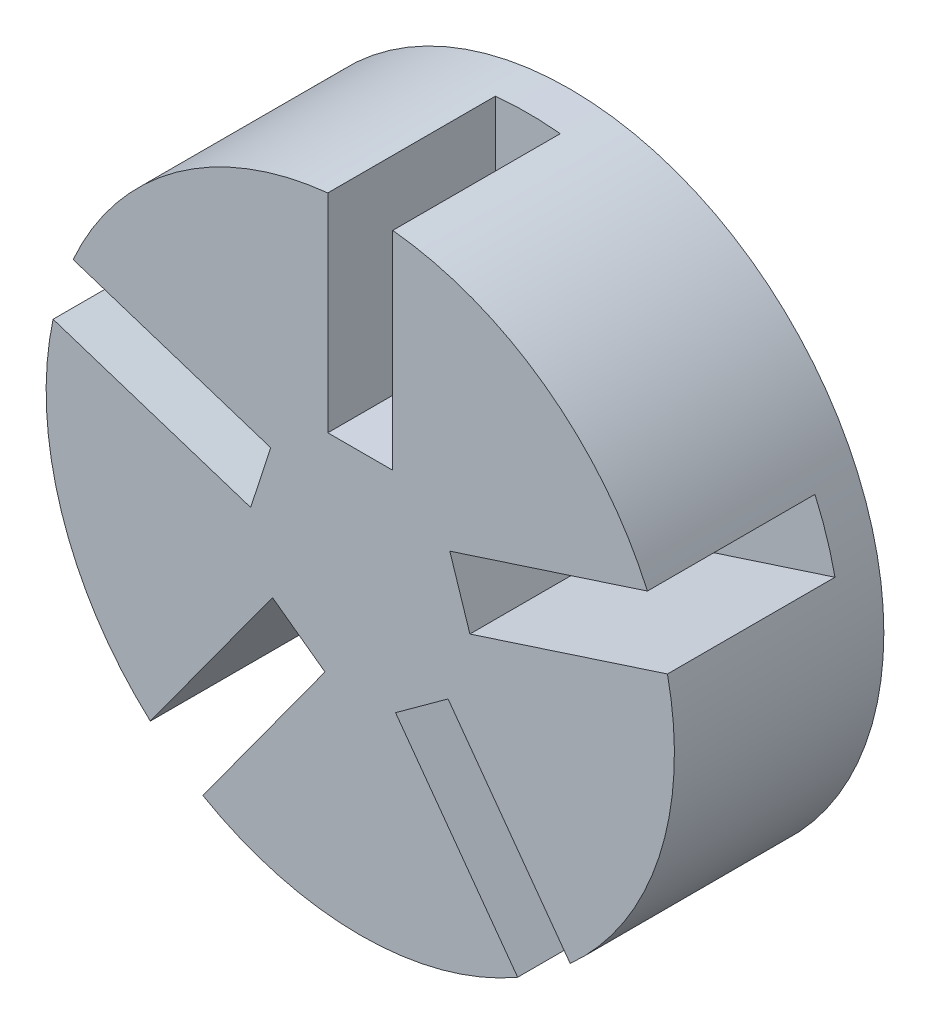
ISO-10303-21;
HEADER;
FILE_DESCRIPTION(('STEP AP214'),'2;1');
FILE_NAME('part.step','',(''),(''),'','','');
FILE_SCHEMA(('AUTOMOTIVE_DESIGN { 1 0 10303 214 1 1 1 1 }'));
ENDSEC;
DATA;
#1=APPLICATION_CONTEXT('core data for automotive mechanical design processes');
#2=APPLICATION_PROTOCOL_DEFINITION('international standard','automotive_design',2000,#1);
#3=PRODUCT_CONTEXT('',#1,'mechanical');
#4=PRODUCT('Part','Part','',(#3));
#5=PRODUCT_RELATED_PRODUCT_CATEGORY('part','',(#4));
#6=PRODUCT_DEFINITION_FORMATION('','',#4);
#7=PRODUCT_DEFINITION_CONTEXT('part definition',#1,'design');
#8=PRODUCT_DEFINITION('design','',#6,#7);
#9=PRODUCT_DEFINITION_SHAPE('','',#8);
#10=(LENGTH_UNIT() NAMED_UNIT(*) SI_UNIT(.MILLI.,.METRE.));
#11=(NAMED_UNIT(*) PLANE_ANGLE_UNIT() SI_UNIT($,.RADIAN.));
#12=(NAMED_UNIT(*) SI_UNIT($,.STERADIAN.) SOLID_ANGLE_UNIT());
#13=UNCERTAINTY_MEASURE_WITH_UNIT(LENGTH_MEASURE(1.E-05),#10,'distance_accuracy_value','');
#14=(GEOMETRIC_REPRESENTATION_CONTEXT(3) GLOBAL_UNCERTAINTY_ASSIGNED_CONTEXT((#13)) GLOBAL_UNIT_ASSIGNED_CONTEXT((#10,
#11,#12)) REPRESENTATION_CONTEXT('',''));
#15=CARTESIAN_POINT('',(0.,0.,0.));
#16=DIRECTION('',(0.,0.,1.));
#17=DIRECTION('',(1.,0.,0.));
#18=AXIS2_PLACEMENT_3D('',#15,#16,#17);
#19=CARTESIAN_POINT('',(0.,0.,10.));
#20=DIRECTION('',(0.,0.,-1.));
#21=DIRECTION('',(-1.,0.,0.));
#22=AXIS2_PLACEMENT_3D('',#19,#20,#21);
#23=CYLINDRICAL_SURFACE('',#22,15.);
#24=CARTESIAN_POINT('',(0.,0.,10.));
#25=DIRECTION('',(0.,0.,1.));
#26=DIRECTION('',(1.,0.,0.));
#27=AXIS2_PLACEMENT_3D('',#24,#25,#26);
#28=CIRCLE('',#27,15.);
#29=CARTESIAN_POINT('',(-14.6684559019519,3.13630378829802,10.));
#30=VERTEX_POINT('',#29);
#31=CARTESIAN_POINT('',(-10.0235569924466,-11.1592251173267,10.));
#32=VERTEX_POINT('',#31);
#33=EDGE_CURVE('E351',#30,#32,#28,.T.);
#34=ORIENTED_EDGE('',*,*,#33,.F.);
#35=DIRECTION('',(0.,0.,-1.));
#36=VECTOR('',#35,1.);
#37=CARTESIAN_POINT('',(-14.6684559019519,3.13630378829802,10.));
#38=LINE('',#37,#36);
#39=CARTESIAN_POINT('',(-14.6684559019519,3.13630378829802,2.));
#40=VERTEX_POINT('',#39);
#41=EDGE_CURVE('E303',#30,#40,#38,.T.);
#42=ORIENTED_EDGE('',*,*,#41,.T.);
#43=CARTESIAN_POINT('',(0.,0.,2.));
#44=DIRECTION('',(0.,0.,-1.));
#45=DIRECTION('',(-1.,0.,0.));
#46=AXIS2_PLACEMENT_3D('',#43,#44,#45);
#47=CIRCLE('',#46,15.);
#48=CARTESIAN_POINT('',(-13.7105032193897,6.08457898881304,2.));
#49=VERTEX_POINT('',#48);
#50=EDGE_CURVE('E11',#40,#49,#47,.T.);
#51=ORIENTED_EDGE('',*,*,#50,.T.);
#52=DIRECTION('',(0.,0.,-1.));
#53=VECTOR('',#52,1.);
#54=CARTESIAN_POINT('',(-13.7105032193897,6.08457898881304,10.));
#55=LINE('',#54,#53);
#56=CARTESIAN_POINT('',(-13.7105032193897,6.08457898881304,10.));
#57=VERTEX_POINT('',#56);
#58=EDGE_CURVE('E300',#49,#57,#55,.F.);
#59=ORIENTED_EDGE('',*,*,#58,.T.);
#60=CARTESIAN_POINT('',(-1.55,14.9197017396461,10.));
#61=VERTEX_POINT('',#60);
#62=EDGE_CURVE('E352',#61,#57,#28,.T.);
#63=ORIENTED_EDGE('',*,*,#62,.F.);
#64=DIRECTION('',(0.,0.,-1.));
#65=VECTOR('',#64,1.);
#66=CARTESIAN_POINT('',(-1.55,14.9197017396461,10.));
#67=LINE('',#66,#65);
#68=CARTESIAN_POINT('',(-1.55,14.9197017396461,2.));
#69=VERTEX_POINT('',#68);
#70=EDGE_CURVE('E276',#61,#69,#67,.T.);
#71=ORIENTED_EDGE('',*,*,#70,.T.);
#72=CARTESIAN_POINT('',(0.,0.,2.));
#73=DIRECTION('',(0.,0.,1.));
#74=DIRECTION('',(1.,0.,0.));
#75=AXIS2_PLACEMENT_3D('',#72,#73,#74);
#76=CIRCLE('',#75,15.);
#77=CARTESIAN_POINT('',(1.55,14.9197017396461,2.));
#78=VERTEX_POINT('',#77);
#79=EDGE_CURVE('E325',#78,#69,#76,.T.);
#80=ORIENTED_EDGE('',*,*,#79,.F.);
#81=DIRECTION('',(0.,0.,-1.));
#82=VECTOR('',#81,1.);
#83=CARTESIAN_POINT('',(1.55,14.9197017396461,10.));
#84=LINE('',#83,#82);
#85=CARTESIAN_POINT('',(1.55,14.9197017396461,10.));
#86=VERTEX_POINT('',#85);
#87=EDGE_CURVE('E281',#78,#86,#84,.F.);
#88=ORIENTED_EDGE('',*,*,#87,.T.);
#89=CARTESIAN_POINT('',(13.7105032193893,6.08457898881385,10.));
#90=VERTEX_POINT('',#89);
#91=EDGE_CURVE('E313',#90,#86,#28,.T.);
#92=ORIENTED_EDGE('',*,*,#91,.F.);
#93=DIRECTION('',(0.,0.,-1.));
#94=VECTOR('',#93,1.);
#95=CARTESIAN_POINT('',(13.7105032193893,6.08457898881385,10.));
#96=LINE('',#95,#94);
#97=CARTESIAN_POINT('',(13.7105032193893,6.08457898881385,2.));
#98=VERTEX_POINT('',#97);
#99=EDGE_CURVE('E182',#90,#98,#96,.T.);
#100=ORIENTED_EDGE('',*,*,#99,.T.);
#101=CARTESIAN_POINT('',(0.,0.,2.));
#102=DIRECTION('',(0.,0.,-1.));
#103=DIRECTION('',(-1.,0.,0.));
#104=AXIS2_PLACEMENT_3D('',#101,#102,#103);
#105=CIRCLE('',#104,15.);
#106=CARTESIAN_POINT('',(14.6684559019517,3.13630378829889,2.));
#107=VERTEX_POINT('',#106);
#108=EDGE_CURVE('E327',#98,#107,#105,.T.);
#109=ORIENTED_EDGE('',*,*,#108,.T.);
#110=DIRECTION('',(0.,0.,-1.));
#111=VECTOR('',#110,1.);
#112=CARTESIAN_POINT('',(14.6684559019517,3.13630378829889,10.));
#113=LINE('',#112,#111);
#114=CARTESIAN_POINT('',(14.6684559019517,3.13630378829889,10.));
#115=VERTEX_POINT('',#114);
#116=EDGE_CURVE('E284',#107,#115,#113,.F.);
#117=ORIENTED_EDGE('',*,*,#116,.T.);
#118=CARTESIAN_POINT('',(10.0235569924483,-11.1592251173252,10.));
#119=VERTEX_POINT('',#118);
#120=EDGE_CURVE('E310',#119,#115,#28,.T.);
#121=ORIENTED_EDGE('',*,*,#120,.F.);
#122=DIRECTION('',(0.,0.,-1.));
#123=VECTOR('',#122,1.);
#124=CARTESIAN_POINT('',(10.0235569924483,-11.1592251173252,10.));
#125=LINE('',#124,#123);
#126=CARTESIAN_POINT('',(10.0235569924483,-11.1592251173252,2.));
#127=VERTEX_POINT('',#126);
#128=EDGE_CURVE('E291',#119,#127,#125,.T.);
#129=ORIENTED_EDGE('',*,*,#128,.T.);
#130=CARTESIAN_POINT('',(0.,0.,2.));
#131=DIRECTION('',(0.,0.,-1.));
#132=DIRECTION('',(-1.,0.,0.));
#133=AXIS2_PLACEMENT_3D('',#130,#131,#132);
#134=CIRCLE('',#133,15.);
#135=CARTESIAN_POINT('',(7.51560430988609,-12.981359399432,2.));
#136=VERTEX_POINT('',#135);
#137=EDGE_CURVE('E330',#127,#136,#134,.T.);
#138=ORIENTED_EDGE('',*,*,#137,.T.);
#139=DIRECTION('',(0.,0.,-1.));
#140=VECTOR('',#139,1.);
#141=CARTESIAN_POINT('',(7.51560430988609,-12.981359399432,10.));
#142=LINE('',#141,#140);
#143=CARTESIAN_POINT('',(7.51560430988609,-12.981359399432,10.));
#144=VERTEX_POINT('',#143);
#145=EDGE_CURVE('E288',#136,#144,#142,.F.);
#146=ORIENTED_EDGE('',*,*,#145,.T.);
#147=CARTESIAN_POINT('',(-7.51560430988409,-12.9813593994332,10.));
#148=VERTEX_POINT('',#147);
#149=EDGE_CURVE('E312',#148,#144,#28,.T.);
#150=ORIENTED_EDGE('',*,*,#149,.F.);
#151=DIRECTION('',(0.,0.,-1.));
#152=VECTOR('',#151,1.);
#153=CARTESIAN_POINT('',(-7.51560430988409,-12.9813593994332,10.));
#154=LINE('',#153,#152);
#155=CARTESIAN_POINT('',(-7.51560430988409,-12.9813593994332,2.));
#156=VERTEX_POINT('',#155);
#157=EDGE_CURVE('E297',#148,#156,#154,.T.);
#158=ORIENTED_EDGE('',*,*,#157,.T.);
#159=CARTESIAN_POINT('',(0.,0.,2.));
#160=DIRECTION('',(0.,0.,-1.));
#161=DIRECTION('',(-1.,0.,0.));
#162=AXIS2_PLACEMENT_3D('',#159,#160,#161);
#163=CIRCLE('',#162,15.);
#164=CARTESIAN_POINT('',(-10.0235569924466,-11.1592251173267,2.));
#165=VERTEX_POINT('',#164);
#166=EDGE_CURVE('E44',#156,#165,#163,.T.);
#167=ORIENTED_EDGE('',*,*,#166,.T.);
#168=DIRECTION('',(0.,0.,-1.));
#169=VECTOR('',#168,1.);
#170=CARTESIAN_POINT('',(-10.0235569924466,-11.1592251173267,10.));
#171=LINE('',#170,#169);
#172=EDGE_CURVE('E294',#165,#32,#171,.F.);
#173=ORIENTED_EDGE('',*,*,#172,.T.);
#174=EDGE_LOOP('',(#34,#42,#51,#59,#63,#71,#80,#88,#92,#100,#109,#117,#121,#129,#138,#146,#150,
#158,#167,#173));
#175=FACE_BOUND('',#174,.T.);
#176=CARTESIAN_POINT('',(0.,0.,0.));
#177=DIRECTION('',(0.,0.,1.));
#178=DIRECTION('',(1.,0.,0.));
#179=AXIS2_PLACEMENT_3D('',#176,#177,#178);
#180=CIRCLE('',#179,15.);
#181=CARTESIAN_POINT('',(15.,0.,0.));
#182=VERTEX_POINT('',#181);
#183=EDGE_CURVE('E309',#182,#182,#180,.T.);
#184=ORIENTED_EDGE('',*,*,#183,.T.);
#185=EDGE_LOOP('',(#184));
#186=FACE_BOUND('',#185,.T.);
#187=ADVANCED_FACE('F37',(#175,#186),#23,.T.);
#188=CARTESIAN_POINT('',(0.,0.,10.));
#189=DIRECTION('',(0.,0.,1.));
#190=DIRECTION('',(1.,0.,0.));
#191=AXIS2_PLACEMENT_3D('',#188,#189,#190);
#192=PLANE('',#191);
#193=DIRECTION('',(0.951056516295154,-0.309016994374947,0.));
#194=VECTOR('',#193,1.);
#195=CARTESIAN_POINT('',(-0.478976341281359,-1.47413760025808,10.));
#196=LINE('',#195,#194);
#197=CARTESIAN_POINT('',(-5.23425892275668,0.0709473716165136,10.));
#198=VERTEX_POINT('',#197);
#199=EDGE_CURVE('E323',#30,#198,#196,.T.);
#200=ORIENTED_EDGE('',*,*,#199,.F.);
#201=ORIENTED_EDGE('',*,*,#33,.T.);
#202=DIRECTION('',(-0.587785252292473,-0.809016994374948,0.));
#203=VECTOR('',#202,1.);
#204=CARTESIAN_POINT('',(-19.0396982170381,-23.5688788912693,10.));
#205=LINE('',#204,#203);
#206=CARTESIAN_POINT('',(-4.1929026027425,-3.13401783082212,10.));
#207=VERTEX_POINT('',#206);
#208=EDGE_CURVE('E238',#207,#32,#205,.T.);
#209=ORIENTED_EDGE('',*,*,#208,.F.);
#210=DIRECTION('',(-0.809016994374947,0.587785252292473,0.));
#211=VECTOR('',#210,1.);
#212=CARTESIAN_POINT('',(-1.68494992018016,-4.95615211292879,10.));
#213=LINE('',#212,#211);
#214=CARTESIAN_POINT('',(-1.68494992018016,-4.95615211292879,10.));
#215=VERTEX_POINT('',#214);
#216=EDGE_CURVE('E59',#215,#207,#213,.T.);
#217=ORIENTED_EDGE('',*,*,#216,.F.);
#218=DIRECTION('',(0.587785252292473,0.809016994374947,0.));
#219=VECTOR('',#218,1.);
#220=CARTESIAN_POINT('',(1.25397634128219,-0.911067141054074,10.));
#221=LINE('',#220,#219);
#222=EDGE_CURVE('E321',#148,#215,#221,.T.);
#223=ORIENTED_EDGE('',*,*,#222,.F.);
#224=ORIENTED_EDGE('',*,*,#149,.T.);
#225=DIRECTION('',(0.587785252292473,-0.809016994374947,0.));
#226=VECTOR('',#225,1.);
#227=CARTESIAN_POINT('',(16.5317455344781,-25.3910131733753,10.));
#228=LINE('',#227,#226);
#229=CARTESIAN_POINT('',(1.68494992018246,-4.95615211292805,10.));
#230=VERTEX_POINT('',#229);
#231=EDGE_CURVE('E223',#230,#144,#228,.T.);
#232=ORIENTED_EDGE('',*,*,#231,.F.);
#233=DIRECTION('',(-0.809016994374947,-0.587785252292473,0.));
#234=VECTOR('',#233,1.);
#235=CARTESIAN_POINT('',(4.1929026027448,-3.13401783082138,10.));
#236=LINE('',#235,#234);
#237=CARTESIAN_POINT('',(4.1929026027448,-3.13401783082138,10.));
#238=VERTEX_POINT('',#237);
#239=EDGE_CURVE('E197',#238,#230,#236,.T.);
#240=ORIENTED_EDGE('',*,*,#239,.F.);
#241=DIRECTION('',(-0.587785252292473,0.809016994374947,0.));
#242=VECTOR('',#241,1.);
#243=CARTESIAN_POINT('',(1.253976341282,0.911067141053941,10.));
#244=LINE('',#243,#242);
#245=EDGE_CURVE('E187',#119,#238,#244,.T.);
#246=ORIENTED_EDGE('',*,*,#245,.F.);
#247=ORIENTED_EDGE('',*,*,#120,.T.);
#248=DIRECTION('',(0.951056516295153,0.309016994374948,0.));
#249=VECTOR('',#248,1.);
#250=CARTESIAN_POINT('',(29.2568788507108,7.87636974132684,10.));
#251=LINE('',#250,#249);
#252=CARTESIAN_POINT('',(5.23425892275756,0.0709473716177216,10.));
#253=VERTEX_POINT('',#252);
#254=EDGE_CURVE('E203',#253,#115,#251,.T.);
#255=ORIENTED_EDGE('',*,*,#254,.F.);
#256=DIRECTION('',(0.309016994374947,-0.951056516295154,0.));
#257=VECTOR('',#256,1.);
#258=CARTESIAN_POINT('',(4.27630624019522,3.0192225721327,10.));
#259=LINE('',#258,#257);
#260=CARTESIAN_POINT('',(4.27630624019522,3.0192225721327,10.));
#261=VERTEX_POINT('',#260);
#262=EDGE_CURVE('E192',#261,#253,#259,.T.);
#263=ORIENTED_EDGE('',*,*,#262,.F.);
#264=DIRECTION('',(-0.951056516295154,-0.309016994374948,0.));
#265=VECTOR('',#264,1.);
#266=CARTESIAN_POINT('',(-0.478976341281248,1.47413760025773,10.));
#267=LINE('',#266,#265);
#268=EDGE_CURVE('E175',#90,#261,#267,.T.);
#269=ORIENTED_EDGE('',*,*,#268,.F.);
#270=ORIENTED_EDGE('',*,*,#91,.T.);
#271=DIRECTION('',(0.,1.,0.));
#272=VECTOR('',#271,1.);
#273=CARTESIAN_POINT('',(1.55,30.2588773814762,10.));
#274=LINE('',#273,#272);
#275=CARTESIAN_POINT('',(1.55,5.,10.));
#276=VERTEX_POINT('',#275);
#277=EDGE_CURVE('E204',#276,#86,#274,.T.);
#278=ORIENTED_EDGE('',*,*,#277,.F.);
#279=DIRECTION('',(1.,0.,0.));
#280=VECTOR('',#279,1.);
#281=CARTESIAN_POINT('',(-1.55,5.,10.));
#282=LINE('',#281,#280);
#283=CARTESIAN_POINT('',(-1.55,5.,10.));
#284=VERTEX_POINT('',#283);
#285=EDGE_CURVE('E206',#284,#276,#282,.T.);
#286=ORIENTED_EDGE('',*,*,#285,.F.);
#287=DIRECTION('',(0.,-1.,0.));
#288=VECTOR('',#287,1.);
#289=CARTESIAN_POINT('',(-1.55,0.,10.));
#290=LINE('',#289,#288);
#291=EDGE_CURVE('E188',#61,#284,#290,.T.);
#292=ORIENTED_EDGE('',*,*,#291,.F.);
#293=ORIENTED_EDGE('',*,*,#62,.T.);
#294=DIRECTION('',(-0.951056516295154,0.309016994374947,0.));
#295=VECTOR('',#294,1.);
#296=CARTESIAN_POINT('',(-28.2989261681476,10.8246449418406,10.));
#297=LINE('',#296,#295);
#298=CARTESIAN_POINT('',(-4.27630624019434,3.01922257213149,10.));
#299=VERTEX_POINT('',#298);
#300=EDGE_CURVE('E253',#299,#57,#297,.T.);
#301=ORIENTED_EDGE('',*,*,#300,.F.);
#302=DIRECTION('',(0.309016994374947,0.951056516295154,0.));
#303=VECTOR('',#302,1.);
#304=CARTESIAN_POINT('',(-5.23425892275668,0.0709473716165136,10.));
#305=LINE('',#304,#303);
#306=EDGE_CURVE('E51',#198,#299,#305,.T.);
#307=ORIENTED_EDGE('',*,*,#306,.F.);
#308=EDGE_LOOP('',(#200,#201,#209,#217,#223,#224,#232,#240,#246,#247,#255,#263,#269,#270,#278,
#286,#292,#293,#301,#307));
#309=FACE_BOUND('',#308,.T.);
#310=ADVANCED_FACE('F201',(#309),#192,.T.);
#311=CARTESIAN_POINT('',(0.,0.,0.));
#312=DIRECTION('',(0.,0.,1.));
#313=DIRECTION('',(1.,0.,0.));
#314=AXIS2_PLACEMENT_3D('',#311,#312,#313);
#315=PLANE('',#314);
#316=CARTESIAN_POINT('',(0.,0.,0.));
#317=DIRECTION('',(0.,0.,1.));
#318=DIRECTION('',(1.,0.,0.));
#319=AXIS2_PLACEMENT_3D('',#316,#317,#318);
#320=CIRCLE('',#319,1.95);
#321=CARTESIAN_POINT('',(1.95,0.,0.));
#322=VERTEX_POINT('',#321);
#323=EDGE_CURVE('E316',#322,#322,#320,.F.);
#324=ORIENTED_EDGE('',*,*,#323,.F.);
#325=EDGE_LOOP('',(#324));
#326=FACE_BOUND('',#325,.T.);
#327=ORIENTED_EDGE('',*,*,#183,.F.);
#328=EDGE_LOOP('',(#327));
#329=FACE_BOUND('',#328,.T.);
#330=ADVANCED_FACE('F414',(#326,#329),#315,.F.);
#331=CARTESIAN_POINT('',(0.,0.,-4.));
#332=DIRECTION('',(0.,0.,1.));
#333=DIRECTION('',(1.,0.,0.));
#334=AXIS2_PLACEMENT_3D('',#331,#332,#333);
#335=CYLINDRICAL_SURFACE('',#334,1.95);
#336=CARTESIAN_POINT('',(0.,0.,-4.));
#337=DIRECTION('',(0.,0.,-1.));
#338=DIRECTION('',(-1.,0.,0.));
#339=AXIS2_PLACEMENT_3D('',#336,#337,#338);
#340=CIRCLE('',#339,1.95);
#341=CARTESIAN_POINT('',(-1.95,0.,-4.));
#342=VERTEX_POINT('',#341);
#343=EDGE_CURVE('E306',#342,#342,#340,.T.);
#344=ORIENTED_EDGE('',*,*,#343,.F.);
#345=EDGE_LOOP('',(#344));
#346=FACE_BOUND('',#345,.T.);
#347=ORIENTED_EDGE('',*,*,#323,.T.);
#348=EDGE_LOOP('',(#347));
#349=FACE_BOUND('',#348,.T.);
#350=ADVANCED_FACE('F419',(#346,#349),#335,.T.);
#351=CARTESIAN_POINT('',(0.,0.,-4.));
#352=DIRECTION('',(0.,0.,-1.));
#353=DIRECTION('',(-1.,0.,0.));
#354=AXIS2_PLACEMENT_3D('',#351,#352,#353);
#355=PLANE('',#354);
#356=ORIENTED_EDGE('',*,*,#343,.T.);
#357=EDGE_LOOP('',(#356));
#358=FACE_BOUND('',#357,.T.);
#359=ADVANCED_FACE('F424',(#358),#355,.T.);
#360=CARTESIAN_POINT('',(0.,0.,2.));
#361=DIRECTION('',(0.,0.,1.));
#362=DIRECTION('',(1.,0.,0.));
#363=AXIS2_PLACEMENT_3D('',#360,#361,#362);
#364=PLANE('',#363);
#365=ORIENTED_EDGE('',*,*,#79,.T.);
#366=DIRECTION('',(0.,-1.,0.));
#367=VECTOR('',#366,1.);
#368=CARTESIAN_POINT('',(-1.55,30.2588773814762,2.));
#369=LINE('',#368,#367);
#370=CARTESIAN_POINT('',(-1.55,5.,2.));
#371=VERTEX_POINT('',#370);
#372=EDGE_CURVE('E266',#69,#371,#369,.T.);
#373=ORIENTED_EDGE('',*,*,#372,.T.);
#374=DIRECTION('',(1.,0.,0.));
#375=VECTOR('',#374,1.);
#376=CARTESIAN_POINT('',(-1.55,5.,2.));
#377=LINE('',#376,#375);
#378=CARTESIAN_POINT('',(1.55,5.,2.));
#379=VERTEX_POINT('',#378);
#380=EDGE_CURVE('E268',#371,#379,#377,.T.);
#381=ORIENTED_EDGE('',*,*,#380,.T.);
#382=DIRECTION('',(0.,1.,0.));
#383=VECTOR('',#382,1.);
#384=CARTESIAN_POINT('',(1.55,30.2588773814762,2.));
#385=LINE('',#384,#383);
#386=EDGE_CURVE('E263',#379,#78,#385,.T.);
#387=ORIENTED_EDGE('',*,*,#386,.T.);
#388=EDGE_LOOP('',(#365,#373,#381,#387));
#389=FACE_BOUND('',#388,.T.);
#390=ADVANCED_FACE('F428',(#389),#364,.T.);
#391=CARTESIAN_POINT('',(1.55,30.2588773814762,2.));
#392=DIRECTION('',(1.,0.,0.));
#393=DIRECTION('',(0.,1.,0.));
#394=AXIS2_PLACEMENT_3D('',#391,#392,#393);
#395=PLANE('',#394);
#396=ORIENTED_EDGE('',*,*,#386,.F.);
#397=DIRECTION('',(0.,0.,1.));
#398=VECTOR('',#397,1.);
#399=CARTESIAN_POINT('',(1.55,5.,2.));
#400=LINE('',#399,#398);
#401=EDGE_CURVE('E274',#379,#276,#400,.T.);
#402=ORIENTED_EDGE('',*,*,#401,.T.);
#403=ORIENTED_EDGE('',*,*,#277,.T.);
#404=ORIENTED_EDGE('',*,*,#87,.F.);
#405=EDGE_LOOP('',(#396,#402,#403,#404));
#406=FACE_BOUND('',#405,.T.);
#407=ADVANCED_FACE('F381',(#406),#395,.F.);
#408=CARTESIAN_POINT('',(-1.55,30.2588773814762,2.));
#409=DIRECTION('',(-1.,0.,0.));
#410=DIRECTION('',(0.,-1.,0.));
#411=AXIS2_PLACEMENT_3D('',#408,#409,#410);
#412=PLANE('',#411);
#413=ORIENTED_EDGE('',*,*,#291,.T.);
#414=DIRECTION('',(0.,0.,1.));
#415=VECTOR('',#414,1.);
#416=CARTESIAN_POINT('',(-1.55,5.,2.));
#417=LINE('',#416,#415);
#418=EDGE_CURVE('E270',#371,#284,#417,.T.);
#419=ORIENTED_EDGE('',*,*,#418,.F.);
#420=ORIENTED_EDGE('',*,*,#372,.F.);
#421=ORIENTED_EDGE('',*,*,#70,.F.);
#422=EDGE_LOOP('',(#413,#419,#420,#421));
#423=FACE_BOUND('',#422,.T.);
#424=ADVANCED_FACE('F388',(#423),#412,.F.);
#425=CARTESIAN_POINT('',(-1.55,5.,2.));
#426=DIRECTION('',(0.,-1.,0.));
#427=DIRECTION('',(0.,0.,-1.));
#428=AXIS2_PLACEMENT_3D('',#425,#426,#427);
#429=PLANE('',#428);
#430=ORIENTED_EDGE('',*,*,#285,.T.);
#431=ORIENTED_EDGE('',*,*,#401,.F.);
#432=ORIENTED_EDGE('',*,*,#380,.F.);
#433=ORIENTED_EDGE('',*,*,#418,.T.);
#434=EDGE_LOOP('',(#430,#431,#432,#433));
#435=FACE_BOUND('',#434,.T.);
#436=ADVANCED_FACE('F384',(#435),#429,.F.);
#437=CARTESIAN_POINT('',(0.,0.,2.));
#438=DIRECTION('',(0.,0.,-1.));
#439=DIRECTION('',(-1.,0.,0.));
#440=AXIS2_PLACEMENT_3D('',#437,#438,#439);
#441=PLANE('',#440);
#442=DIRECTION('',(-0.951056516295153,-0.309016994374948,0.));
#443=VECTOR('',#442,1.);
#444=CARTESIAN_POINT('',(28.2989261681484,10.8246449418418,2.));
#445=LINE('',#444,#443);
#446=CARTESIAN_POINT('',(4.27630624019522,3.0192225721327,2.));
#447=VERTEX_POINT('',#446);
#448=EDGE_CURVE('E210',#98,#447,#445,.T.);
#449=ORIENTED_EDGE('',*,*,#448,.T.);
#450=DIRECTION('',(0.309016994374947,-0.951056516295154,0.));
#451=VECTOR('',#450,1.);
#452=CARTESIAN_POINT('',(4.27630624019522,3.0192225721327,2.));
#453=LINE('',#452,#451);
#454=CARTESIAN_POINT('',(5.23425892275756,0.0709473716177202,2.));
#455=VERTEX_POINT('',#454);
#456=EDGE_CURVE('E195',#447,#455,#453,.T.);
#457=ORIENTED_EDGE('',*,*,#456,.T.);
#458=DIRECTION('',(0.951056516295153,0.309016994374948,0.));
#459=VECTOR('',#458,1.);
#460=CARTESIAN_POINT('',(29.2568788507108,7.87636974132684,2.));
#461=LINE('',#460,#459);
#462=EDGE_CURVE('E212',#455,#107,#461,.T.);
#463=ORIENTED_EDGE('',*,*,#462,.T.);
#464=ORIENTED_EDGE('',*,*,#108,.F.);
#465=EDGE_LOOP('',(#449,#457,#463,#464));
#466=FACE_BOUND('',#465,.T.);
#467=ADVANCED_FACE('F374',(#466),#441,.F.);
#468=CARTESIAN_POINT('',(28.2989261681484,10.8246449418418,2.));
#469=DIRECTION('',(-0.309016994374948,0.951056516295154,0.));
#470=DIRECTION('',(-0.951056516295154,-0.309016994374948,0.));
#471=AXIS2_PLACEMENT_3D('',#468,#469,#470);
#472=PLANE('',#471);
#473=ORIENTED_EDGE('',*,*,#268,.T.);
#474=DIRECTION('',(0.,0.,1.));
#475=VECTOR('',#474,1.);
#476=CARTESIAN_POINT('',(4.27630624019522,3.0192225721327,2.));
#477=LINE('',#476,#475);
#478=EDGE_CURVE('E179',#447,#261,#477,.T.);
#479=ORIENTED_EDGE('',*,*,#478,.F.);
#480=ORIENTED_EDGE('',*,*,#448,.F.);
#481=ORIENTED_EDGE('',*,*,#99,.F.);
#482=EDGE_LOOP('',(#473,#479,#480,#481));
#483=FACE_BOUND('',#482,.T.);
#484=ADVANCED_FACE('F177',(#483),#472,.F.);
#485=CARTESIAN_POINT('',(29.2568788507108,7.87636974132684,2.));
#486=DIRECTION('',(0.309016994374948,-0.951056516295154,0.));
#487=DIRECTION('',(0.951056516295154,0.309016994374948,0.));
#488=AXIS2_PLACEMENT_3D('',#485,#486,#487);
#489=PLANE('',#488);
#490=ORIENTED_EDGE('',*,*,#462,.F.);
#491=DIRECTION('',(0.,0.,1.));
#492=VECTOR('',#491,1.);
#493=CARTESIAN_POINT('',(5.23425892275756,0.0709473716177202,2.));
#494=LINE('',#493,#492);
#495=EDGE_CURVE('E196',#455,#253,#494,.T.);
#496=ORIENTED_EDGE('',*,*,#495,.T.);
#497=ORIENTED_EDGE('',*,*,#254,.T.);
#498=ORIENTED_EDGE('',*,*,#116,.F.);
#499=EDGE_LOOP('',(#490,#496,#497,#498));
#500=FACE_BOUND('',#499,.T.);
#501=ADVANCED_FACE('F372',(#500),#489,.F.);
#502=CARTESIAN_POINT('',(4.27630624019522,3.0192225721327,2.));
#503=DIRECTION('',(-0.951056516295154,-0.309016994374947,0.));
#504=DIRECTION('',(0.309016994374947,-0.951056516295154,0.));
#505=AXIS2_PLACEMENT_3D('',#502,#503,#504);
#506=PLANE('',#505);
#507=ORIENTED_EDGE('',*,*,#262,.T.);
#508=ORIENTED_EDGE('',*,*,#495,.F.);
#509=ORIENTED_EDGE('',*,*,#456,.F.);
#510=ORIENTED_EDGE('',*,*,#478,.T.);
#511=EDGE_LOOP('',(#507,#508,#509,#510));
#512=FACE_BOUND('',#511,.T.);
#513=ADVANCED_FACE('F191',(#512),#506,.F.);
#514=CARTESIAN_POINT('',(0.,0.,2.));
#515=DIRECTION('',(0.,0.,-1.));
#516=DIRECTION('',(-1.,0.,0.));
#517=AXIS2_PLACEMENT_3D('',#514,#515,#516);
#518=PLANE('',#517);
#519=DIRECTION('',(-0.587785252292473,0.809016994374947,0.));
#520=VECTOR('',#519,1.);
#521=CARTESIAN_POINT('',(19.0396982170404,-23.5688788912686,2.));
#522=LINE('',#521,#520);
#523=CARTESIAN_POINT('',(4.1929026027448,-3.13401783082138,2.));
#524=VERTEX_POINT('',#523);
#525=EDGE_CURVE('E219',#127,#524,#522,.T.);
#526=ORIENTED_EDGE('',*,*,#525,.T.);
#527=DIRECTION('',(-0.809016994374947,-0.587785252292473,0.));
#528=VECTOR('',#527,1.);
#529=CARTESIAN_POINT('',(4.1929026027448,-3.13401783082138,2.));
#530=LINE('',#529,#528);
#531=CARTESIAN_POINT('',(1.68494992018246,-4.95615211292805,2.));
#532=VERTEX_POINT('',#531);
#533=EDGE_CURVE('E225',#524,#532,#530,.T.);
#534=ORIENTED_EDGE('',*,*,#533,.T.);
#535=DIRECTION('',(0.587785252292473,-0.809016994374947,0.));
#536=VECTOR('',#535,1.);
#537=CARTESIAN_POINT('',(16.5317455344781,-25.3910131733753,2.));
#538=LINE('',#537,#536);
#539=EDGE_CURVE('E228',#532,#136,#538,.T.);
#540=ORIENTED_EDGE('',*,*,#539,.T.);
#541=ORIENTED_EDGE('',*,*,#137,.F.);
#542=EDGE_LOOP('',(#526,#534,#540,#541));
#543=FACE_BOUND('',#542,.T.);
#544=ADVANCED_FACE('F361',(#543),#518,.F.);
#545=CARTESIAN_POINT('',(19.0396982170404,-23.5688788912686,2.));
#546=DIRECTION('',(0.809016994374947,0.587785252292473,0.));
#547=DIRECTION('',(-0.587785252292473,0.809016994374947,0.));
#548=AXIS2_PLACEMENT_3D('',#545,#546,#547);
#549=PLANE('',#548);
#550=ORIENTED_EDGE('',*,*,#245,.T.);
#551=DIRECTION('',(0.,0.,1.));
#552=VECTOR('',#551,1.);
#553=CARTESIAN_POINT('',(4.1929026027448,-3.13401783082138,2.));
#554=LINE('',#553,#552);
#555=EDGE_CURVE('E220',#524,#238,#554,.T.);
#556=ORIENTED_EDGE('',*,*,#555,.F.);
#557=ORIENTED_EDGE('',*,*,#525,.F.);
#558=ORIENTED_EDGE('',*,*,#128,.F.);
#559=EDGE_LOOP('',(#550,#556,#557,#558));
#560=FACE_BOUND('',#559,.T.);
#561=ADVANCED_FACE('F484',(#560),#549,.F.);
#562=CARTESIAN_POINT('',(16.5317455344781,-25.3910131733753,2.));
#563=DIRECTION('',(-0.809016994374947,-0.587785252292473,0.));
#564=DIRECTION('',(0.587785252292473,-0.809016994374947,0.));
#565=AXIS2_PLACEMENT_3D('',#562,#563,#564);
#566=PLANE('',#565);
#567=ORIENTED_EDGE('',*,*,#539,.F.);
#568=DIRECTION('',(0.,0.,1.));
#569=VECTOR('',#568,1.);
#570=CARTESIAN_POINT('',(1.68494992018246,-4.95615211292805,2.));
#571=LINE('',#570,#569);
#572=EDGE_CURVE('E216',#532,#230,#571,.T.);
#573=ORIENTED_EDGE('',*,*,#572,.T.);
#574=ORIENTED_EDGE('',*,*,#231,.T.);
#575=ORIENTED_EDGE('',*,*,#145,.F.);
#576=EDGE_LOOP('',(#567,#573,#574,#575));
#577=FACE_BOUND('',#576,.T.);
#578=ADVANCED_FACE('F359',(#577),#566,.F.);
#579=CARTESIAN_POINT('',(4.1929026027448,-3.13401783082138,2.));
#580=DIRECTION('',(-0.587785252292473,0.809016994374947,0.));
#581=DIRECTION('',(-0.809016994374947,-0.587785252292473,0.));
#582=AXIS2_PLACEMENT_3D('',#579,#580,#581);
#583=PLANE('',#582);
#584=ORIENTED_EDGE('',*,*,#239,.T.);
#585=ORIENTED_EDGE('',*,*,#572,.F.);
#586=ORIENTED_EDGE('',*,*,#533,.F.);
#587=ORIENTED_EDGE('',*,*,#555,.T.);
#588=EDGE_LOOP('',(#584,#585,#586,#587));
#589=FACE_BOUND('',#588,.T.);
#590=ADVANCED_FACE('F366',(#589),#583,.F.);
#591=CARTESIAN_POINT('',(0.,0.,2.));
#592=DIRECTION('',(0.,0.,-1.));
#593=DIRECTION('',(-1.,0.,0.));
#594=AXIS2_PLACEMENT_3D('',#591,#592,#593);
#595=PLANE('',#594);
#596=DIRECTION('',(0.587785252292473,0.809016994374947,0.));
#597=VECTOR('',#596,1.);
#598=CARTESIAN_POINT('',(-16.5317455344758,-25.391013173376,2.));
#599=LINE('',#598,#597);
#600=CARTESIAN_POINT('',(-1.68494992018016,-4.95615211292879,2.));
#601=VERTEX_POINT('',#600);
#602=EDGE_CURVE('E235',#156,#601,#599,.T.);
#603=ORIENTED_EDGE('',*,*,#602,.T.);
#604=DIRECTION('',(-0.809016994374947,0.587785252292473,0.));
#605=VECTOR('',#604,1.);
#606=CARTESIAN_POINT('',(-1.68494992018016,-4.95615211292879,2.));
#607=LINE('',#606,#605);
#608=CARTESIAN_POINT('',(-4.1929026027425,-3.13401783082213,2.));
#609=VERTEX_POINT('',#608);
#610=EDGE_CURVE('E240',#601,#609,#607,.T.);
#611=ORIENTED_EDGE('',*,*,#610,.T.);
#612=DIRECTION('',(-0.587785252292473,-0.809016994374948,0.));
#613=VECTOR('',#612,1.);
#614=CARTESIAN_POINT('',(-19.0396982170381,-23.5688788912693,2.));
#615=LINE('',#614,#613);
#616=EDGE_CURVE('E243',#609,#165,#615,.T.);
#617=ORIENTED_EDGE('',*,*,#616,.T.);
#618=ORIENTED_EDGE('',*,*,#166,.F.);
#619=EDGE_LOOP('',(#603,#611,#617,#618));
#620=FACE_BOUND('',#619,.T.);
#621=ADVANCED_FACE('F340',(#620),#595,.F.);
#622=CARTESIAN_POINT('',(-16.5317455344758,-25.391013173376,2.));
#623=DIRECTION('',(0.809016994374948,-0.587785252292473,0.));
#624=DIRECTION('',(0.587785252292473,0.809016994374947,0.));
#625=AXIS2_PLACEMENT_3D('',#622,#623,#624);
#626=PLANE('',#625);
#627=ORIENTED_EDGE('',*,*,#222,.T.);
#628=DIRECTION('',(0.,0.,1.));
#629=VECTOR('',#628,1.);
#630=CARTESIAN_POINT('',(-1.68494992018016,-4.95615211292879,2.));
#631=LINE('',#630,#629);
#632=EDGE_CURVE('E236',#601,#215,#631,.T.);
#633=ORIENTED_EDGE('',*,*,#632,.F.);
#634=ORIENTED_EDGE('',*,*,#602,.F.);
#635=ORIENTED_EDGE('',*,*,#157,.F.);
#636=EDGE_LOOP('',(#627,#633,#634,#635));
#637=FACE_BOUND('',#636,.T.);
#638=ADVANCED_FACE('F344',(#637),#626,.F.);
#639=CARTESIAN_POINT('',(-19.0396982170381,-23.5688788912693,2.));
#640=DIRECTION('',(-0.809016994374948,0.587785252292473,0.));
#641=DIRECTION('',(-0.587785252292473,-0.809016994374948,0.));
#642=AXIS2_PLACEMENT_3D('',#639,#640,#641);
#643=PLANE('',#642);
#644=ORIENTED_EDGE('',*,*,#616,.F.);
#645=DIRECTION('',(0.,0.,1.));
#646=VECTOR('',#645,1.);
#647=CARTESIAN_POINT('',(-4.1929026027425,-3.13401783082213,2.));
#648=LINE('',#647,#646);
#649=EDGE_CURVE('E233',#609,#207,#648,.T.);
#650=ORIENTED_EDGE('',*,*,#649,.T.);
#651=ORIENTED_EDGE('',*,*,#208,.T.);
#652=ORIENTED_EDGE('',*,*,#172,.F.);
#653=EDGE_LOOP('',(#644,#650,#651,#652));
#654=FACE_BOUND('',#653,.T.);
#655=ADVANCED_FACE('F350',(#654),#643,.F.);
#656=CARTESIAN_POINT('',(-1.68494992018016,-4.95615211292879,2.));
#657=DIRECTION('',(0.587785252292473,0.809016994374947,0.));
#658=DIRECTION('',(-0.809016994374948,0.587785252292473,0.));
#659=AXIS2_PLACEMENT_3D('',#656,#657,#658);
#660=PLANE('',#659);
#661=ORIENTED_EDGE('',*,*,#216,.T.);
#662=ORIENTED_EDGE('',*,*,#649,.F.);
#663=ORIENTED_EDGE('',*,*,#610,.F.);
#664=ORIENTED_EDGE('',*,*,#632,.T.);
#665=EDGE_LOOP('',(#661,#662,#663,#664));
#666=FACE_BOUND('',#665,.T.);
#667=ADVANCED_FACE('F347',(#666),#660,.F.);
#668=CARTESIAN_POINT('',(0.,0.,2.));
#669=DIRECTION('',(0.,0.,-1.));
#670=DIRECTION('',(-1.,0.,0.));
#671=AXIS2_PLACEMENT_3D('',#668,#669,#670);
#672=PLANE('',#671);
#673=DIRECTION('',(0.951056516295154,-0.309016994374947,0.));
#674=VECTOR('',#673,1.);
#675=CARTESIAN_POINT('',(-29.2568788507099,7.87636974132562,2.));
#676=LINE('',#675,#674);
#677=CARTESIAN_POINT('',(-5.23425892275668,0.0709473716165136,2.));
#678=VERTEX_POINT('',#677);
#679=EDGE_CURVE('E250',#40,#678,#676,.T.);
#680=ORIENTED_EDGE('',*,*,#679,.T.);
#681=DIRECTION('',(0.309016994374947,0.951056516295154,0.));
#682=VECTOR('',#681,1.);
#683=CARTESIAN_POINT('',(-5.23425892275668,0.0709473716165136,2.));
#684=LINE('',#683,#682);
#685=CARTESIAN_POINT('',(-4.27630624019434,3.01922257213149,2.));
#686=VERTEX_POINT('',#685);
#687=EDGE_CURVE('E255',#678,#686,#684,.T.);
#688=ORIENTED_EDGE('',*,*,#687,.T.);
#689=DIRECTION('',(-0.951056516295154,0.309016994374947,0.));
#690=VECTOR('',#689,1.);
#691=CARTESIAN_POINT('',(-28.2989261681476,10.8246449418406,2.));
#692=LINE('',#691,#690);
#693=EDGE_CURVE('E258',#686,#49,#692,.T.);
#694=ORIENTED_EDGE('',*,*,#693,.T.);
#695=ORIENTED_EDGE('',*,*,#50,.F.);
#696=EDGE_LOOP('',(#680,#688,#694,#695));
#697=FACE_BOUND('',#696,.T.);
#698=ADVANCED_FACE('F395',(#697),#672,.F.);
#699=CARTESIAN_POINT('',(-29.2568788507099,7.87636974132562,2.));
#700=DIRECTION('',(-0.309016994374947,-0.951056516295154,0.));
#701=DIRECTION('',(0.951056516295154,-0.309016994374947,0.));
#702=AXIS2_PLACEMENT_3D('',#699,#700,#701);
#703=PLANE('',#702);
#704=ORIENTED_EDGE('',*,*,#199,.T.);
#705=DIRECTION('',(0.,0.,1.));
#706=VECTOR('',#705,1.);
#707=CARTESIAN_POINT('',(-5.23425892275668,0.0709473716165136,2.));
#708=LINE('',#707,#706);
#709=EDGE_CURVE('E251',#678,#198,#708,.T.);
#710=ORIENTED_EDGE('',*,*,#709,.F.);
#711=ORIENTED_EDGE('',*,*,#679,.F.);
#712=ORIENTED_EDGE('',*,*,#41,.F.);
#713=EDGE_LOOP('',(#704,#710,#711,#712));
#714=FACE_BOUND('',#713,.T.);
#715=ADVANCED_FACE('F401',(#714),#703,.F.);
#716=CARTESIAN_POINT('',(-28.2989261681476,10.8246449418406,2.));
#717=DIRECTION('',(0.309016994374947,0.951056516295154,0.));
#718=DIRECTION('',(-0.951056516295154,0.309016994374947,0.));
#719=AXIS2_PLACEMENT_3D('',#716,#717,#718);
#720=PLANE('',#719);
#721=ORIENTED_EDGE('',*,*,#693,.F.);
#722=DIRECTION('',(0.,0.,1.));
#723=VECTOR('',#722,1.);
#724=CARTESIAN_POINT('',(-4.27630624019434,3.01922257213149,2.));
#725=LINE('',#724,#723);
#726=EDGE_CURVE('E248',#686,#299,#725,.T.);
#727=ORIENTED_EDGE('',*,*,#726,.T.);
#728=ORIENTED_EDGE('',*,*,#300,.T.);
#729=ORIENTED_EDGE('',*,*,#58,.F.);
#730=EDGE_LOOP('',(#721,#727,#728,#729));
#731=FACE_BOUND('',#730,.T.);
#732=ADVANCED_FACE('F393',(#731),#720,.F.);
#733=CARTESIAN_POINT('',(-5.23425892275668,0.0709473716165136,2.));
#734=DIRECTION('',(0.951056516295154,-0.309016994374947,0.));
#735=DIRECTION('',(0.309016994374947,0.951056516295154,0.));
#736=AXIS2_PLACEMENT_3D('',#733,#734,#735);
#737=PLANE('',#736);
#738=ORIENTED_EDGE('',*,*,#306,.T.);
#739=ORIENTED_EDGE('',*,*,#726,.F.);
#740=ORIENTED_EDGE('',*,*,#687,.F.);
#741=ORIENTED_EDGE('',*,*,#709,.T.);
#742=EDGE_LOOP('',(#738,#739,#740,#741));
#743=FACE_BOUND('',#742,.T.);
#744=ADVANCED_FACE('F399',(#743),#737,.F.);
#745=CLOSED_SHELL('',(#187,#310,#330,#350,#359,#390,#407,#424,#436,#467,#484,#501,#513,#544,
#561,#578,#590,#621,#638,#655,#667,#698,#715,#732,#744));
#746=MANIFOLD_SOLID_BREP('B2',#745);
#747=ADVANCED_BREP_SHAPE_REPRESENTATION('',(#18,#746),#14);
#748=SHAPE_DEFINITION_REPRESENTATION(#9,#747);
ENDSEC;
END-ISO-10303-21;
